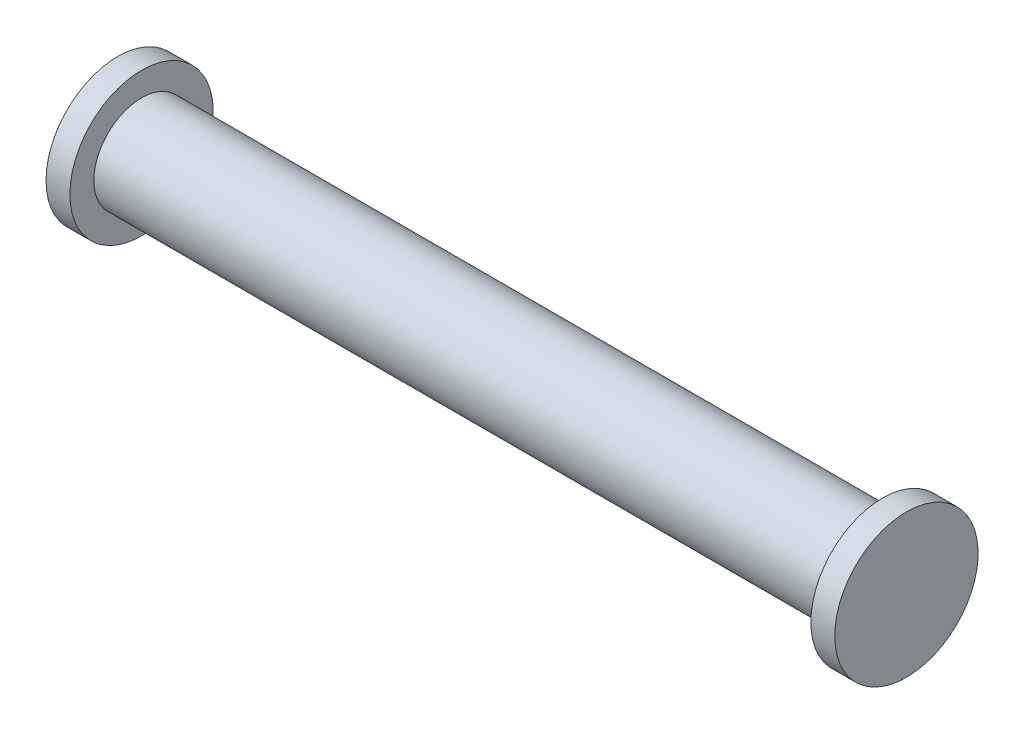
ISO-10303-21;
HEADER;
FILE_DESCRIPTION(('STEP AP214'),'2;1');
FILE_NAME('part.step','',(''),(''),'','','');
FILE_SCHEMA(('AUTOMOTIVE_DESIGN { 1 0 10303 214 1 1 1 1 }'));
ENDSEC;
DATA;
#1=APPLICATION_CONTEXT('core data for automotive mechanical design processes');
#2=APPLICATION_PROTOCOL_DEFINITION('international standard','automotive_design',2000,#1);
#3=PRODUCT_CONTEXT('',#1,'mechanical');
#4=PRODUCT('Part','Part','',(#3));
#5=PRODUCT_RELATED_PRODUCT_CATEGORY('part','',(#4));
#6=PRODUCT_DEFINITION_FORMATION('','',#4);
#7=PRODUCT_DEFINITION_CONTEXT('part definition',#1,'design');
#8=PRODUCT_DEFINITION('design','',#6,#7);
#9=PRODUCT_DEFINITION_SHAPE('','',#8);
#10=(LENGTH_UNIT() NAMED_UNIT(*) SI_UNIT(.MILLI.,.METRE.));
#11=(NAMED_UNIT(*) PLANE_ANGLE_UNIT() SI_UNIT($,.RADIAN.));
#12=(NAMED_UNIT(*) SI_UNIT($,.STERADIAN.) SOLID_ANGLE_UNIT());
#13=UNCERTAINTY_MEASURE_WITH_UNIT(LENGTH_MEASURE(1.E-05),#10,'distance_accuracy_value','');
#14=(GEOMETRIC_REPRESENTATION_CONTEXT(3) GLOBAL_UNCERTAINTY_ASSIGNED_CONTEXT((#13)) GLOBAL_UNIT_ASSIGNED_CONTEXT((#10,
#11,#12)) REPRESENTATION_CONTEXT('',''));
#15=CARTESIAN_POINT('',(0.,0.,0.));
#16=DIRECTION('',(0.,0.,1.));
#17=DIRECTION('',(1.,0.,0.));
#18=AXIS2_PLACEMENT_3D('',#15,#16,#17);
#19=CARTESIAN_POINT('',(-14.,0.,0.));
#20=DIRECTION('',(1.,0.,0.));
#21=DIRECTION('',(0.,0.,-1.));
#22=AXIS2_PLACEMENT_3D('',#19,#20,#21);
#23=PLANE('',#22);
#24=CARTESIAN_POINT('',(-14.,0.,0.));
#25=DIRECTION('',(-1.,0.,0.));
#26=DIRECTION('',(0.,0.,1.));
#27=AXIS2_PLACEMENT_3D('',#24,#25,#26);
#28=CIRCLE('',#27,4.5);
#29=CARTESIAN_POINT('',(-14.,0.,4.5));
#30=VERTEX_POINT('',#29);
#31=EDGE_CURVE('E10',#30,#30,#28,.T.);
#32=ORIENTED_EDGE('',*,*,#31,.T.);
#33=EDGE_LOOP('',(#32));
#34=FACE_BOUND('',#33,.T.);
#35=ADVANCED_FACE('F31',(#34),#23,.F.);
#36=CARTESIAN_POINT('',(-18.,0.,0.));
#37=DIRECTION('',(-1.,0.,0.));
#38=DIRECTION('',(0.,0.,1.));
#39=AXIS2_PLACEMENT_3D('',#36,#37,#38);
#40=CYLINDRICAL_SURFACE('',#39,4.5);
#41=ORIENTED_EDGE('',*,*,#31,.F.);
#42=EDGE_LOOP('',(#41));
#43=FACE_BOUND('',#42,.T.);
#44=CARTESIAN_POINT('',(-12.5,0.,0.));
#45=DIRECTION('',(-1.,0.,0.));
#46=DIRECTION('',(0.,0.,1.));
#47=AXIS2_PLACEMENT_3D('',#44,#45,#46);
#48=CIRCLE('',#47,4.5);
#49=CARTESIAN_POINT('',(-12.5,0.,4.5));
#50=VERTEX_POINT('',#49);
#51=EDGE_CURVE('E37',#50,#50,#48,.T.);
#52=ORIENTED_EDGE('',*,*,#51,.T.);
#53=EDGE_LOOP('',(#52));
#54=FACE_BOUND('',#53,.T.);
#55=ADVANCED_FACE('F69',(#43,#54),#40,.T.);
#56=CARTESIAN_POINT('',(-12.5,4.5,0.));
#57=DIRECTION('',(-1.,0.,0.));
#58=DIRECTION('',(0.,0.,1.));
#59=AXIS2_PLACEMENT_3D('',#56,#57,#58);
#60=PLANE('',#59);
#61=ORIENTED_EDGE('',*,*,#51,.F.);
#62=EDGE_LOOP('',(#61));
#63=FACE_BOUND('',#62,.T.);
#64=CARTESIAN_POINT('',(-12.5,0.,0.));
#65=DIRECTION('',(-1.,0.,0.));
#66=DIRECTION('',(0.,0.,1.));
#67=AXIS2_PLACEMENT_3D('',#64,#65,#66);
#68=CIRCLE('',#67,3.);
#69=CARTESIAN_POINT('',(-12.5,0.,3.));
#70=VERTEX_POINT('',#69);
#71=EDGE_CURVE('E41',#70,#70,#68,.T.);
#72=ORIENTED_EDGE('',*,*,#71,.T.);
#73=EDGE_LOOP('',(#72));
#74=FACE_BOUND('',#73,.T.);
#75=ADVANCED_FACE('F73',(#63,#74),#60,.F.);
#76=CARTESIAN_POINT('',(-18.,0.,0.));
#77=DIRECTION('',(-1.,0.,0.));
#78=DIRECTION('',(0.,0.,1.));
#79=AXIS2_PLACEMENT_3D('',#76,#77,#78);
#80=CYLINDRICAL_SURFACE('',#79,3.);
#81=ORIENTED_EDGE('',*,*,#71,.F.);
#82=EDGE_LOOP('',(#81));
#83=FACE_BOUND('',#82,.T.);
#84=CARTESIAN_POINT('',(34.,0.,0.));
#85=DIRECTION('',(-1.,0.,0.));
#86=DIRECTION('',(0.,0.,1.));
#87=AXIS2_PLACEMENT_3D('',#84,#85,#86);
#88=CIRCLE('',#87,3.);
#89=CARTESIAN_POINT('',(34.,0.,3.));
#90=VERTEX_POINT('',#89);
#91=EDGE_CURVE('E45',#90,#90,#88,.T.);
#92=ORIENTED_EDGE('',*,*,#91,.T.);
#93=EDGE_LOOP('',(#92));
#94=FACE_BOUND('',#93,.T.);
#95=ADVANCED_FACE('F78',(#83,#94),#80,.T.);
#96=CARTESIAN_POINT('',(34.,3.,0.));
#97=DIRECTION('',(1.,0.,0.));
#98=DIRECTION('',(0.,0.,-1.));
#99=AXIS2_PLACEMENT_3D('',#96,#97,#98);
#100=PLANE('',#99);
#101=ORIENTED_EDGE('',*,*,#91,.F.);
#102=EDGE_LOOP('',(#101));
#103=FACE_BOUND('',#102,.T.);
#104=CARTESIAN_POINT('',(34.,0.,0.));
#105=DIRECTION('',(-1.,0.,0.));
#106=DIRECTION('',(0.,0.,1.));
#107=AXIS2_PLACEMENT_3D('',#104,#105,#106);
#108=CIRCLE('',#107,4.5);
#109=CARTESIAN_POINT('',(34.,0.,4.5));
#110=VERTEX_POINT('',#109);
#111=EDGE_CURVE('E50',#110,#110,#108,.T.);
#112=ORIENTED_EDGE('',*,*,#111,.T.);
#113=EDGE_LOOP('',(#112));
#114=FACE_BOUND('',#113,.T.);
#115=ADVANCED_FACE('F65',(#103,#114),#100,.F.);
#116=CARTESIAN_POINT('',(-18.,0.,0.));
#117=DIRECTION('',(-1.,0.,0.));
#118=DIRECTION('',(0.,0.,1.));
#119=AXIS2_PLACEMENT_3D('',#116,#117,#118);
#120=CYLINDRICAL_SURFACE('',#119,4.5);
#121=ORIENTED_EDGE('',*,*,#111,.F.);
#122=EDGE_LOOP('',(#121));
#123=FACE_BOUND('',#122,.T.);
#124=CARTESIAN_POINT('',(35.5,0.,0.));
#125=DIRECTION('',(-1.,0.,0.));
#126=DIRECTION('',(0.,0.,1.));
#127=AXIS2_PLACEMENT_3D('',#124,#125,#126);
#128=CIRCLE('',#127,4.5);
#129=CARTESIAN_POINT('',(35.5,0.,4.5));
#130=VERTEX_POINT('',#129);
#131=EDGE_CURVE('E53',#130,#130,#128,.T.);
#132=ORIENTED_EDGE('',*,*,#131,.T.);
#133=EDGE_LOOP('',(#132));
#134=FACE_BOUND('',#133,.T.);
#135=ADVANCED_FACE('F57',(#123,#134),#120,.T.);
#136=CARTESIAN_POINT('',(35.5,4.5,0.));
#137=DIRECTION('',(-1.,0.,0.));
#138=DIRECTION('',(0.,0.,1.));
#139=AXIS2_PLACEMENT_3D('',#136,#137,#138);
#140=PLANE('',#139);
#141=ORIENTED_EDGE('',*,*,#131,.F.);
#142=EDGE_LOOP('',(#141));
#143=FACE_BOUND('',#142,.T.);
#144=ADVANCED_FACE('F59',(#143),#140,.F.);
#145=CLOSED_SHELL('',(#35,#55,#75,#95,#115,#135,#144));
#146=MANIFOLD_SOLID_BREP('B2',#145);
#147=ADVANCED_BREP_SHAPE_REPRESENTATION('',(#18,#146),#14);
#148=SHAPE_DEFINITION_REPRESENTATION(#9,#147);
ENDSEC;
END-ISO-10303-21;
